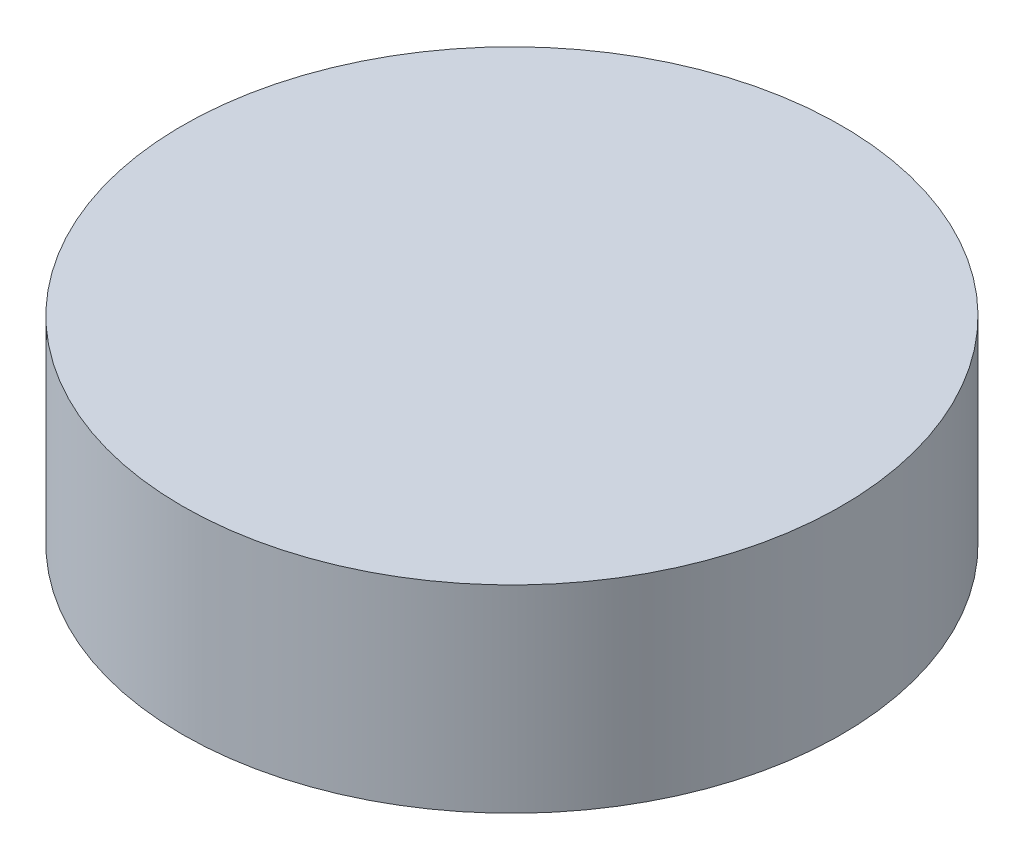
ISO-10303-21;
HEADER;
FILE_DESCRIPTION(('STEP AP214'),'2;1');
FILE_NAME('part.step','',(''),(''),'','','');
FILE_SCHEMA(('AUTOMOTIVE_DESIGN { 1 0 10303 214 1 1 1 1 }'));
ENDSEC;
DATA;
#1=APPLICATION_CONTEXT('core data for automotive mechanical design processes');
#2=APPLICATION_PROTOCOL_DEFINITION('international standard','automotive_design',2000,#1);
#3=PRODUCT_CONTEXT('',#1,'mechanical');
#4=PRODUCT('Part','Part','',(#3));
#5=PRODUCT_RELATED_PRODUCT_CATEGORY('part','',(#4));
#6=PRODUCT_DEFINITION_FORMATION('','',#4);
#7=PRODUCT_DEFINITION_CONTEXT('part definition',#1,'design');
#8=PRODUCT_DEFINITION('design','',#6,#7);
#9=PRODUCT_DEFINITION_SHAPE('','',#8);
#10=(LENGTH_UNIT() NAMED_UNIT(*) SI_UNIT(.MILLI.,.METRE.));
#11=(NAMED_UNIT(*) PLANE_ANGLE_UNIT() SI_UNIT($,.RADIAN.));
#12=(NAMED_UNIT(*) SI_UNIT($,.STERADIAN.) SOLID_ANGLE_UNIT());
#13=UNCERTAINTY_MEASURE_WITH_UNIT(LENGTH_MEASURE(1.E-05),#10,'distance_accuracy_value','');
#14=(GEOMETRIC_REPRESENTATION_CONTEXT(3) GLOBAL_UNCERTAINTY_ASSIGNED_CONTEXT((#13)) GLOBAL_UNIT_ASSIGNED_CONTEXT((#10,
#11,#12)) REPRESENTATION_CONTEXT('',''));
#15=CARTESIAN_POINT('',(0.,0.,0.));
#16=DIRECTION('',(0.,0.,1.));
#17=DIRECTION('',(1.,0.,0.));
#18=AXIS2_PLACEMENT_3D('',#15,#16,#17);
#19=CARTESIAN_POINT('',(0.,0.024,0.));
#20=DIRECTION('',(0.,-1.,0.));
#21=DIRECTION('',(0.,0.,-1.));
#22=AXIS2_PLACEMENT_3D('',#19,#20,#21);
#23=CYLINDRICAL_SURFACE('',#22,0.0399999999999984);
#24=CARTESIAN_POINT('',(0.,0.024,0.));
#25=DIRECTION('',(0.,1.,0.));
#26=DIRECTION('',(0.,0.,1.));
#27=AXIS2_PLACEMENT_3D('',#24,#25,#26);
#28=CIRCLE('',#27,0.0399999999999984);
#29=CARTESIAN_POINT('',(0.,0.024,0.0399999999999984));
#30=VERTEX_POINT('',#29);
#31=EDGE_CURVE('E10',#30,#30,#28,.T.);
#32=ORIENTED_EDGE('',*,*,#31,.F.);
#33=EDGE_LOOP('',(#32));
#34=FACE_BOUND('',#33,.T.);
#35=CARTESIAN_POINT('',(0.,0.,0.));
#36=DIRECTION('',(0.,1.,0.));
#37=DIRECTION('',(0.,0.,1.));
#38=AXIS2_PLACEMENT_3D('',#35,#36,#37);
#39=CIRCLE('',#38,0.0399999999999984);
#40=CARTESIAN_POINT('',(0.,0.,0.0399999999999984));
#41=VERTEX_POINT('',#40);
#42=EDGE_CURVE('E34',#41,#41,#39,.T.);
#43=ORIENTED_EDGE('',*,*,#42,.T.);
#44=EDGE_LOOP('',(#43));
#45=FACE_BOUND('',#44,.T.);
#46=ADVANCED_FACE('F31',(#34,#45),#23,.T.);
#47=CARTESIAN_POINT('',(0.,0.024,0.));
#48=DIRECTION('',(0.,1.,0.));
#49=DIRECTION('',(0.,0.,1.));
#50=AXIS2_PLACEMENT_3D('',#47,#48,#49);
#51=PLANE('',#50);
#52=ORIENTED_EDGE('',*,*,#31,.T.);
#53=EDGE_LOOP('',(#52));
#54=FACE_BOUND('',#53,.T.);
#55=ADVANCED_FACE('F46',(#54),#51,.T.);
#56=CARTESIAN_POINT('',(0.,0.,0.));
#57=DIRECTION('',(0.,1.,0.));
#58=DIRECTION('',(0.,0.,1.));
#59=AXIS2_PLACEMENT_3D('',#56,#57,#58);
#60=PLANE('',#59);
#61=ORIENTED_EDGE('',*,*,#42,.F.);
#62=EDGE_LOOP('',(#61));
#63=FACE_BOUND('',#62,.T.);
#64=ADVANCED_FACE('F44',(#63),#60,.F.);
#65=CLOSED_SHELL('',(#46,#55,#64));
#66=MANIFOLD_SOLID_BREP('B2',#65);
#67=ADVANCED_BREP_SHAPE_REPRESENTATION('',(#18,#66),#14);
#68=SHAPE_DEFINITION_REPRESENTATION(#9,#67);
ENDSEC;
END-ISO-10303-21;
